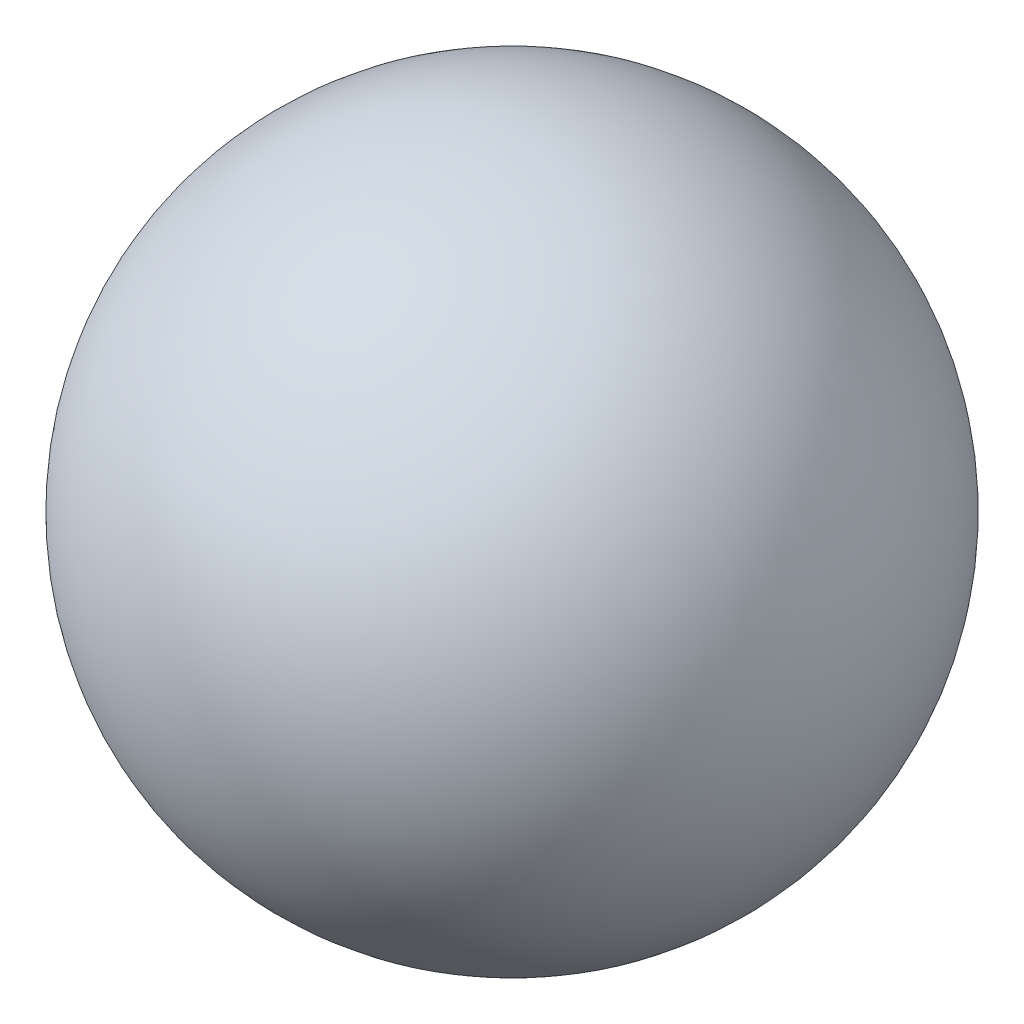
ISO-10303-21;
HEADER;
FILE_DESCRIPTION(('STEP AP214'),'2;1');
FILE_NAME('part.step','',(''),(''),'','','');
FILE_SCHEMA(('AUTOMOTIVE_DESIGN { 1 0 10303 214 1 1 1 1 }'));
ENDSEC;
DATA;
#1=APPLICATION_CONTEXT('core data for automotive mechanical design processes');
#2=APPLICATION_PROTOCOL_DEFINITION('international standard','automotive_design',2000,#1);
#3=PRODUCT_CONTEXT('',#1,'mechanical');
#4=PRODUCT('Part','Part','',(#3));
#5=PRODUCT_RELATED_PRODUCT_CATEGORY('part','',(#4));
#6=PRODUCT_DEFINITION_FORMATION('','',#4);
#7=PRODUCT_DEFINITION_CONTEXT('part definition',#1,'design');
#8=PRODUCT_DEFINITION('design','',#6,#7);
#9=PRODUCT_DEFINITION_SHAPE('','',#8);
#10=(LENGTH_UNIT() NAMED_UNIT(*) SI_UNIT(.MILLI.,.METRE.));
#11=(NAMED_UNIT(*) PLANE_ANGLE_UNIT() SI_UNIT($,.RADIAN.));
#12=(NAMED_UNIT(*) SI_UNIT($,.STERADIAN.) SOLID_ANGLE_UNIT());
#13=UNCERTAINTY_MEASURE_WITH_UNIT(LENGTH_MEASURE(1.E-05),#10,'distance_accuracy_value','');
#14=(GEOMETRIC_REPRESENTATION_CONTEXT(3) GLOBAL_UNCERTAINTY_ASSIGNED_CONTEXT((#13)) GLOBAL_UNIT_ASSIGNED_CONTEXT((#10,
#11,#12)) REPRESENTATION_CONTEXT('',''));
#15=CARTESIAN_POINT('',(0.,0.,0.));
#16=DIRECTION('',(0.,0.,1.));
#17=DIRECTION('',(1.,0.,0.));
#18=AXIS2_PLACEMENT_3D('',#15,#16,#17);
#19=CARTESIAN_POINT('',(0.,0.,0.));
#20=DIRECTION('',(0.,1.,0.));
#21=DIRECTION('',(1.,0.,0.));
#22=AXIS2_PLACEMENT_3D('',#19,#20,#21);
#23=SPHERICAL_SURFACE('',#22,2.25);
#24=CARTESIAN_POINT('',(0.,2.25,0.));
#25=VERTEX_POINT('',#24);
#26=VERTEX_LOOP('',#25);
#27=FACE_BOUND('',#26,.T.);
#28=ADVANCED_FACE('F39',(#27),#23,.T.);
#29=CLOSED_SHELL('',(#28));
#30=MANIFOLD_SOLID_BREP('B2',#29);
#31=ADVANCED_BREP_SHAPE_REPRESENTATION('',(#18,#30),#14);
#32=SHAPE_DEFINITION_REPRESENTATION(#9,#31);
ENDSEC;
END-ISO-10303-21;
